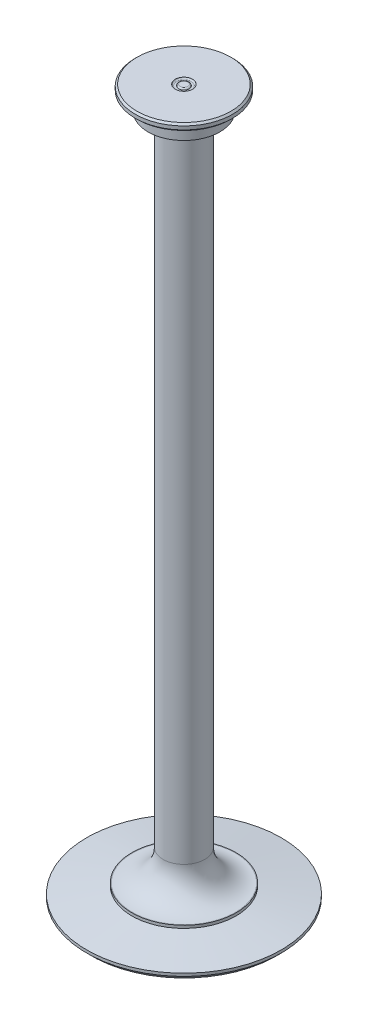
ISO-10303-21;
HEADER;
FILE_DESCRIPTION(('STEP AP214'),'2;1');
FILE_NAME('part.step','',(''),(''),'','','');
FILE_SCHEMA(('AUTOMOTIVE_DESIGN { 1 0 10303 214 1 1 1 1 }'));
ENDSEC;
DATA;
#1=APPLICATION_CONTEXT('core data for automotive mechanical design processes');
#2=APPLICATION_PROTOCOL_DEFINITION('international standard','automotive_design',2000,#1);
#3=PRODUCT_CONTEXT('',#1,'mechanical');
#4=PRODUCT('Part','Part','',(#3));
#5=PRODUCT_RELATED_PRODUCT_CATEGORY('part','',(#4));
#6=PRODUCT_DEFINITION_FORMATION('','',#4);
#7=PRODUCT_DEFINITION_CONTEXT('part definition',#1,'design');
#8=PRODUCT_DEFINITION('design','',#6,#7);
#9=PRODUCT_DEFINITION_SHAPE('','',#8);
#10=(LENGTH_UNIT() NAMED_UNIT(*) SI_UNIT(.MILLI.,.METRE.));
#11=(NAMED_UNIT(*) PLANE_ANGLE_UNIT() SI_UNIT($,.RADIAN.));
#12=(NAMED_UNIT(*) SI_UNIT($,.STERADIAN.) SOLID_ANGLE_UNIT());
#13=UNCERTAINTY_MEASURE_WITH_UNIT(LENGTH_MEASURE(1.E-05),#10,'distance_accuracy_value','');
#14=(GEOMETRIC_REPRESENTATION_CONTEXT(3) GLOBAL_UNCERTAINTY_ASSIGNED_CONTEXT((#13)) GLOBAL_UNIT_ASSIGNED_CONTEXT((#10,
#11,#12)) REPRESENTATION_CONTEXT('',''));
#15=CARTESIAN_POINT('',(0.,0.,0.));
#16=DIRECTION('',(0.,0.,1.));
#17=DIRECTION('',(1.,0.,0.));
#18=AXIS2_PLACEMENT_3D('',#15,#16,#17);
#19=CARTESIAN_POINT('',(0.,99.5012679214001,0.));
#20=DIRECTION('',(0.,1.,0.));
#21=DIRECTION('',(0.,0.,1.));
#22=AXIS2_PLACEMENT_3D('',#19,#20,#21);
#23=PLANE('',#22);
#24=CARTESIAN_POINT('',(0.,99.5012679214001,0.));
#25=DIRECTION('',(0.,1.,0.));
#26=DIRECTION('',(0.,0.,1.));
#27=AXIS2_PLACEMENT_3D('',#24,#25,#26);
#28=CIRCLE('',#27,6.74999999999995);
#29=CARTESIAN_POINT('',(0.,99.5012679214001,6.74999999999995));
#30=VERTEX_POINT('',#29);
#31=EDGE_CURVE('E70',#30,#30,#28,.F.);
#32=ORIENTED_EDGE('',*,*,#31,.T.);
#33=EDGE_LOOP('',(#32));
#34=FACE_BOUND('',#33,.T.);
#35=CARTESIAN_POINT('',(0.,99.5012679214001,0.));
#36=DIRECTION('',(0.,1.,0.));
#37=DIRECTION('',(0.,0.,1.));
#38=AXIS2_PLACEMENT_3D('',#35,#36,#37);
#39=CIRCLE('',#38,5.175);
#40=CARTESIAN_POINT('',(0.,99.5012679214001,5.175));
#41=VERTEX_POINT('',#40);
#42=EDGE_CURVE('E10',#41,#41,#39,.F.);
#43=ORIENTED_EDGE('',*,*,#42,.F.);
#44=EDGE_LOOP('',(#43));
#45=FACE_BOUND('',#44,.T.);
#46=ADVANCED_FACE('F38',(#34,#45),#23,.F.);
#47=CARTESIAN_POINT('',(0.,120.300257794623,0.));
#48=DIRECTION('',(0.,-1.,0.));
#49=DIRECTION('',(0.,0.,-1.));
#50=AXIS2_PLACEMENT_3D('',#47,#48,#49);
#51=CYLINDRICAL_SURFACE('',#50,7.);
#52=CARTESIAN_POINT('',(0.,99.7512679214001,0.));
#53=DIRECTION('',(0.,1.,0.));
#54=DIRECTION('',(0.,0.,1.));
#55=AXIS2_PLACEMENT_3D('',#52,#53,#54);
#56=CIRCLE('',#55,7.);
#57=CARTESIAN_POINT('',(0.,99.7512679214001,-7.));
#58=VERTEX_POINT('',#57);
#59=EDGE_CURVE('E73',#58,#58,#56,.T.);
#60=CARTESIAN_POINT('',(0.,100.2512679214,0.));
#61=DIRECTION('',(0.,1.,0.));
#62=DIRECTION('',(0.,0.,1.));
#63=AXIS2_PLACEMENT_3D('',#60,#61,#62);
#64=CIRCLE('',#63,7.);
#65=CARTESIAN_POINT('',(0.,100.2512679214,-7.));
#66=VERTEX_POINT('',#65);
#67=EDGE_CURVE('E76',#66,#66,#64,.F.);
#68=CARTESIAN_POINT('',(0.,99.7512679214001,-7.));
#69=CARTESIAN_POINT('',(0.,99.7564762547334,-7.));
#70=CARTESIAN_POINT('',(0.,99.7616845880668,-7.));
#71=CARTESIAN_POINT('',(0.,99.7721012547334,-7.));
#72=CARTESIAN_POINT('',(0.,99.7773095880668,-7.));
#73=CARTESIAN_POINT('',(0.,99.7877262547334,-7.));
#74=CARTESIAN_POINT('',(0.,99.7929345880667,-7.));
#75=CARTESIAN_POINT('',(0.,99.8033512547334,-7.));
#76=CARTESIAN_POINT('',(0.,99.8085595880668,-7.));
#77=CARTESIAN_POINT('',(0.,99.8189762547334,-7.));
#78=CARTESIAN_POINT('',(0.,99.8241845880668,-7.));
#79=CARTESIAN_POINT('',(0.,99.8346012547334,-7.));
#80=CARTESIAN_POINT('',(0.,99.8398095880667,-7.));
#81=CARTESIAN_POINT('',(0.,99.8502262547334,-7.));
#82=CARTESIAN_POINT('',(0.,99.8554345880668,-7.));
#83=CARTESIAN_POINT('',(0.,99.8658512547334,-7.));
#84=CARTESIAN_POINT('',(0.,99.8710595880668,-7.));
#85=CARTESIAN_POINT('',(0.,99.8814762547334,-7.));
#86=CARTESIAN_POINT('',(0.,99.8866845880668,-7.));
#87=CARTESIAN_POINT('',(0.,99.8971012547334,-7.));
#88=CARTESIAN_POINT('',(0.,99.9023095880668,-7.));
#89=CARTESIAN_POINT('',(0.,99.9127262547334,-7.));
#90=CARTESIAN_POINT('',(0.,99.9179345880668,-7.));
#91=CARTESIAN_POINT('',(0.,99.9283512547334,-7.));
#92=CARTESIAN_POINT('',(0.,99.9335595880668,-7.));
#93=CARTESIAN_POINT('',(0.,99.9439762547334,-7.));
#94=CARTESIAN_POINT('',(0.,99.9491845880668,-7.));
#95=CARTESIAN_POINT('',(0.,99.9596012547334,-7.));
#96=CARTESIAN_POINT('',(0.,99.9648095880668,-7.));
#97=CARTESIAN_POINT('',(0.,99.9752262547334,-7.));
#98=CARTESIAN_POINT('',(0.,99.9804345880668,-7.));
#99=CARTESIAN_POINT('',(0.,99.9908512547334,-7.));
#100=CARTESIAN_POINT('',(0.,99.9960595880668,-7.));
#101=CARTESIAN_POINT('',(0.,100.006476254733,-7.));
#102=CARTESIAN_POINT('',(0.,100.011684588067,-7.));
#103=CARTESIAN_POINT('',(0.,100.022101254733,-7.));
#104=CARTESIAN_POINT('',(0.,100.027309588067,-7.));
#105=CARTESIAN_POINT('',(0.,100.037726254733,-7.));
#106=CARTESIAN_POINT('',(0.,100.042934588067,-7.));
#107=CARTESIAN_POINT('',(0.,100.053351254733,-7.));
#108=CARTESIAN_POINT('',(0.,100.058559588067,-7.));
#109=CARTESIAN_POINT('',(0.,100.068976254733,-7.));
#110=CARTESIAN_POINT('',(0.,100.074184588067,-7.));
#111=CARTESIAN_POINT('',(0.,100.084601254733,-7.));
#112=CARTESIAN_POINT('',(0.,100.089809588067,-7.));
#113=CARTESIAN_POINT('',(0.,100.100226254733,-7.));
#114=CARTESIAN_POINT('',(0.,100.105434588067,-7.));
#115=CARTESIAN_POINT('',(0.,100.115851254733,-7.));
#116=CARTESIAN_POINT('',(0.,100.121059588067,-7.));
#117=CARTESIAN_POINT('',(0.,100.131476254733,-7.));
#118=CARTESIAN_POINT('',(0.,100.136684588067,-7.));
#119=CARTESIAN_POINT('',(0.,100.147101254733,-7.));
#120=CARTESIAN_POINT('',(0.,100.152309588067,-7.));
#121=CARTESIAN_POINT('',(0.,100.162726254733,-7.));
#122=CARTESIAN_POINT('',(0.,100.167934588067,-7.));
#123=CARTESIAN_POINT('',(0.,100.178351254733,-7.));
#124=CARTESIAN_POINT('',(0.,100.183559588067,-7.));
#125=CARTESIAN_POINT('',(0.,100.193976254733,-7.));
#126=CARTESIAN_POINT('',(0.,100.199184588067,-7.));
#127=CARTESIAN_POINT('',(0.,100.209601254733,-7.));
#128=CARTESIAN_POINT('',(0.,100.214809588067,-7.));
#129=CARTESIAN_POINT('',(0.,100.225226254733,-7.));
#130=CARTESIAN_POINT('',(0.,100.230434588067,-7.));
#131=CARTESIAN_POINT('',(0.,100.240851254733,-7.));
#132=CARTESIAN_POINT('',(0.,100.246059588067,-7.));
#133=CARTESIAN_POINT('',(0.,100.2512679214,-7.));
#134=B_SPLINE_CURVE_WITH_KNOTS('',3,(#68,#69,#70,#71,#72,#73,#74,#75,#76,#77,#78,#79,#80,#81,
#82,#83,#84,#85,#86,#87,#88,#89,#90,#91,#92,#93,#94,#95,#96,#97,#98,#99,#100,#101,#102,#103,
#104,#105,#106,#107,#108,#109,#110,#111,#112,#113,#114,#115,#116,#117,#118,#119,#120,#121,#122,
#123,#124,#125,#126,#127,#128,#129,#130,#131,#132,#133),.UNSPECIFIED.,.F.,.F.,(4,2,2,2,2,2,2,2,
2,2,2,2,2,2,2,2,2,2,2,2,2,2,2,2,2,2,2,2,2,2,2,2,4),(0.,0.0156250000000052,0.0312499999999966,
0.0468750000000018,0.062500000000007,0.0781249999999983,0.0937500000000036,0.109375000000009,
0.125000000000014,0.140625000000005,0.156250000000011,0.171875000000016,0.187500000000007,
0.203125000000012,0.218750000000018,0.234375000000009,0.250000000000014,0.265625000000019,
0.281250000000011,0.296875000000016,0.312500000000021,0.328125000000012,0.343750000000018,
0.359375000000023,0.375000000000014,0.390625000000019,0.406250000000025,0.42187500000003,
0.437500000000021,0.453125000000026,0.468750000000032,0.484375000000023,0.500000000000028),.UNSPECIFIED.);
#135=EDGE_CURVE('BSEAM119',#58,#66,#134,.T.);
#136=ORIENTED_EDGE('',*,*,#59,.T.);
#137=ORIENTED_EDGE('',*,*,#67,.T.);
#138=ORIENTED_EDGE('',*,*,#135,.T.);
#139=ORIENTED_EDGE('',*,*,#135,.F.);
#140=EDGE_LOOP('',(#136,#138,#137,#139));
#141=FACE_BOUND('',#140,.T.);
#142=ADVANCED_FACE('F119',(#141),#51,.T.);
#143=CARTESIAN_POINT('',(0.,100.5012679214,0.));
#144=DIRECTION('',(0.,1.,0.));
#145=DIRECTION('',(0.,0.,1.));
#146=AXIS2_PLACEMENT_3D('',#143,#144,#145);
#147=PLANE('',#146);
#148=CARTESIAN_POINT('',(0.,100.5012679214,0.));
#149=DIRECTION('',(0.,1.,0.));
#150=DIRECTION('',(0.,0.,1.));
#151=AXIS2_PLACEMENT_3D('',#148,#149,#150);
#152=CIRCLE('',#151,1.25);
#153=CARTESIAN_POINT('',(0.,100.5012679214,1.25));
#154=VERTEX_POINT('',#153);
#155=EDGE_CURVE('E88',#154,#154,#152,.T.);
#156=ORIENTED_EDGE('',*,*,#155,.F.);
#157=EDGE_LOOP('',(#156));
#158=FACE_BOUND('',#157,.T.);
#159=CARTESIAN_POINT('',(0.,100.5012679214,0.));
#160=DIRECTION('',(0.,1.,0.));
#161=DIRECTION('',(0.,0.,1.));
#162=AXIS2_PLACEMENT_3D('',#159,#160,#161);
#163=CIRCLE('',#162,6.75000000000006);
#164=CARTESIAN_POINT('',(0.,100.5012679214,6.75000000000006));
#165=VERTEX_POINT('',#164);
#166=EDGE_CURVE('E67',#165,#165,#163,.T.);
#167=ORIENTED_EDGE('',*,*,#166,.T.);
#168=EDGE_LOOP('',(#167));
#169=FACE_BOUND('',#168,.T.);
#170=ADVANCED_FACE('F125',(#158,#169),#147,.T.);
#171=CARTESIAN_POINT('',(0.,99.7512679214001,0.));
#172=DIRECTION('',(0.,1.,0.));
#173=DIRECTION('',(0.,0.,1.));
#174=AXIS2_PLACEMENT_3D('',#171,#172,#173);
#175=CONICAL_SURFACE('',#174,7.,0.785398163397467);
#176=ORIENTED_EDGE('',*,*,#31,.F.);
#177=EDGE_LOOP('',(#176));
#178=FACE_BOUND('',#177,.T.);
#179=ORIENTED_EDGE('',*,*,#59,.F.);
#180=EDGE_LOOP('',(#179));
#181=FACE_BOUND('',#180,.T.);
#182=ADVANCED_FACE('F135',(#178,#181),#175,.T.);
#183=CARTESIAN_POINT('',(0.,100.5012679214,0.));
#184=DIRECTION('',(0.,-1.,0.));
#185=DIRECTION('',(0.,0.,-1.));
#186=AXIS2_PLACEMENT_3D('',#183,#184,#185);
#187=CONICAL_SURFACE('',#186,6.75000000000006,0.78539816339744);
#188=ORIENTED_EDGE('',*,*,#67,.F.);
#189=EDGE_LOOP('',(#188));
#190=FACE_BOUND('',#189,.T.);
#191=ORIENTED_EDGE('',*,*,#166,.F.);
#192=EDGE_LOOP('',(#191));
#193=FACE_BOUND('',#192,.T.);
#194=ADVANCED_FACE('F148',(#190,#193),#187,.T.);
#195=CARTESIAN_POINT('',(0.,100.3012679214,0.));
#196=DIRECTION('',(0.,1.,0.));
#197=DIRECTION('',(0.,0.,1.));
#198=AXIS2_PLACEMENT_3D('',#195,#196,#197);
#199=PLANE('',#198);
#200=CARTESIAN_POINT('',(0.,100.3012679214,0.));
#201=DIRECTION('',(0.,1.,0.));
#202=DIRECTION('',(0.,0.,1.));
#203=AXIS2_PLACEMENT_3D('',#200,#201,#202);
#204=CIRCLE('',#203,1.05);
#205=CARTESIAN_POINT('',(0.,100.3012679214,1.05));
#206=VERTEX_POINT('',#205);
#207=EDGE_CURVE('E49',#206,#206,#204,.T.);
#208=ORIENTED_EDGE('',*,*,#207,.T.);
#209=EDGE_LOOP('',(#208));
#210=FACE_BOUND('',#209,.T.);
#211=CARTESIAN_POINT('',(0.,100.3012679214,0.));
#212=DIRECTION('',(0.,1.,0.));
#213=DIRECTION('',(0.,0.,1.));
#214=AXIS2_PLACEMENT_3D('',#211,#212,#213);
#215=CIRCLE('',#214,0.75);
#216=CARTESIAN_POINT('',(0.,100.3012679214,0.75));
#217=VERTEX_POINT('',#216);
#218=EDGE_CURVE('E91',#217,#217,#215,.T.);
#219=ORIENTED_EDGE('',*,*,#218,.F.);
#220=EDGE_LOOP('',(#219));
#221=FACE_BOUND('',#220,.T.);
#222=ADVANCED_FACE('F152',(#210,#221),#199,.T.);
#223=CARTESIAN_POINT('',(0.,100.5012679214,0.));
#224=DIRECTION('',(0.,1.,0.));
#225=DIRECTION('',(0.,0.,1.));
#226=AXIS2_PLACEMENT_3D('',#223,#224,#225);
#227=CIRCLE('',#226,0.55);
#228=CARTESIAN_POINT('',(0.,100.5012679214,0.55));
#229=VERTEX_POINT('',#228);
#230=EDGE_CURVE('E45',#229,#229,#227,.T.);
#231=ORIENTED_EDGE('',*,*,#230,.T.);
#232=EDGE_LOOP('',(#231));
#233=FACE_BOUND('',#232,.T.);
#234=ADVANCED_FACE('F137',(#233),#147,.T.);
#235=CARTESIAN_POINT('',(0.,100.5012679214,0.));
#236=DIRECTION('',(0.,1.,0.));
#237=DIRECTION('',(0.,0.,1.));
#238=AXIS2_PLACEMENT_3D('',#235,#236,#237);
#239=TOROIDAL_SURFACE('',#238,1.05,0.2);
#240=ORIENTED_EDGE('',*,*,#155,.T.);
#241=EDGE_LOOP('',(#240));
#242=FACE_BOUND('',#241,.T.);
#243=ORIENTED_EDGE('',*,*,#207,.F.);
#244=EDGE_LOOP('',(#243));
#245=FACE_BOUND('',#244,.T.);
#246=ADVANCED_FACE('F116',(#242,#245),#239,.F.);
#247=CARTESIAN_POINT('',(0.,100.3012679214,0.));
#248=DIRECTION('',(0.,1.,0.));
#249=DIRECTION('',(0.,0.,1.));
#250=AXIS2_PLACEMENT_3D('',#247,#248,#249);
#251=TOROIDAL_SURFACE('',#250,0.55,0.2);
#252=ORIENTED_EDGE('',*,*,#218,.T.);
#253=EDGE_LOOP('',(#252));
#254=FACE_BOUND('',#253,.T.);
#255=ORIENTED_EDGE('',*,*,#230,.F.);
#256=EDGE_LOOP('',(#255));
#257=FACE_BOUND('',#256,.T.);
#258=ADVANCED_FACE('F40',(#254,#257),#251,.T.);
#259=CARTESIAN_POINT('',(0.,97.1412679214001,0.));
#260=DIRECTION('',(0.,-1.,0.));
#261=DIRECTION('',(0.,0.,-1.));
#262=AXIS2_PLACEMENT_3D('',#259,#260,#261);
#263=PLANE('',#262);
#264=CARTESIAN_POINT('',(0.,97.1412679214001,0.));
#265=DIRECTION('',(0.,-1.,0.));
#266=DIRECTION('',(0.,0.,-1.));
#267=AXIS2_PLACEMENT_3D('',#264,#265,#266);
#268=CIRCLE('',#267,5.175);
#269=CARTESIAN_POINT('',(0.,97.1412679214001,-5.175));
#270=VERTEX_POINT('',#269);
#271=EDGE_CURVE('E94',#270,#270,#268,.T.);
#272=ORIENTED_EDGE('',*,*,#271,.T.);
#273=EDGE_LOOP('',(#272));
#274=FACE_BOUND('',#273,.T.);
#275=CARTESIAN_POINT('',(0.,97.1412679214001,0.));
#276=DIRECTION('',(0.,-1.,0.));
#277=DIRECTION('',(0.,0.,-1.));
#278=AXIS2_PLACEMENT_3D('',#275,#276,#277);
#279=CIRCLE('',#278,2.99999999999999);
#280=CARTESIAN_POINT('',(0.,97.1412679214001,-2.99999999999999));
#281=VERTEX_POINT('',#280);
#282=EDGE_CURVE('E97',#281,#281,#279,.T.);
#283=ORIENTED_EDGE('',*,*,#282,.F.);
#284=EDGE_LOOP('',(#283));
#285=FACE_BOUND('',#284,.T.);
#286=ADVANCED_FACE('F104',(#274,#285),#263,.T.);
#287=CARTESIAN_POINT('',(0.,97.1412679214001,0.));
#288=DIRECTION('',(0.,1.,0.));
#289=DIRECTION('',(0.,0.,1.));
#290=AXIS2_PLACEMENT_3D('',#287,#288,#289);
#291=CYLINDRICAL_SURFACE('',#290,5.175);
#292=ORIENTED_EDGE('',*,*,#271,.F.);
#293=EDGE_LOOP('',(#292));
#294=FACE_BOUND('',#293,.T.);
#295=ORIENTED_EDGE('',*,*,#42,.T.);
#296=EDGE_LOOP('',(#295));
#297=FACE_BOUND('',#296,.T.);
#298=ADVANCED_FACE('F106',(#294,#297),#291,.T.);
#299=CARTESIAN_POINT('',(0.,-1.5,0.));
#300=DIRECTION('',(0.,-1.,0.));
#301=DIRECTION('',(0.,0.,-1.));
#302=AXIS2_PLACEMENT_3D('',#299,#300,#301);
#303=PLANE('',#302);
#304=CARTESIAN_POINT('',(0.,-1.5,0.));
#305=DIRECTION('',(0.,-1.,0.));
#306=DIRECTION('',(0.,0.,-1.));
#307=AXIS2_PLACEMENT_3D('',#304,#305,#306);
#308=CIRCLE('',#307,13.3);
#309=CARTESIAN_POINT('',(0.,-1.5,-13.3));
#310=VERTEX_POINT('',#309);
#311=EDGE_CURVE('E64',#310,#310,#308,.T.);
#312=ORIENTED_EDGE('',*,*,#311,.T.);
#313=EDGE_LOOP('',(#312));
#314=FACE_BOUND('',#313,.T.);
#315=ADVANCED_FACE('F113',(#314),#303,.T.);
#316=CARTESIAN_POINT('',(0.,-1.5,0.));
#317=DIRECTION('',(0.,1.,0.));
#318=DIRECTION('',(0.,0.,1.));
#319=AXIS2_PLACEMENT_3D('',#316,#317,#318);
#320=CONICAL_SURFACE('',#319,13.3,0.785398163397452);
#321=CARTESIAN_POINT('',(0.,-0.799999999999999,0.));
#322=DIRECTION('',(0.,-1.,0.));
#323=DIRECTION('',(0.,0.,-1.));
#324=AXIS2_PLACEMENT_3D('',#321,#322,#323);
#325=CIRCLE('',#324,14.);
#326=CARTESIAN_POINT('',(0.,-0.799999999999999,-14.));
#327=VERTEX_POINT('',#326);
#328=EDGE_CURVE('E61',#327,#327,#325,.F.);
#329=ORIENTED_EDGE('',*,*,#328,.F.);
#330=EDGE_LOOP('',(#329));
#331=FACE_BOUND('',#330,.T.);
#332=ORIENTED_EDGE('',*,*,#311,.F.);
#333=EDGE_LOOP('',(#332));
#334=FACE_BOUND('',#333,.T.);
#335=ADVANCED_FACE('F154',(#331,#334),#320,.T.);
#336=CARTESIAN_POINT('',(0.,-1.5,0.));
#337=DIRECTION('',(0.,1.,0.));
#338=DIRECTION('',(0.,0.,1.));
#339=AXIS2_PLACEMENT_3D('',#336,#337,#338);
#340=CYLINDRICAL_SURFACE('',#339,14.);
#341=ORIENTED_EDGE('',*,*,#328,.T.);
#342=EDGE_LOOP('',(#341));
#343=FACE_BOUND('',#342,.T.);
#344=CARTESIAN_POINT('',(0.,-0.399999999999999,0.));
#345=DIRECTION('',(0.,-1.,0.));
#346=DIRECTION('',(0.,0.,-1.));
#347=AXIS2_PLACEMENT_3D('',#344,#345,#346);
#348=CIRCLE('',#347,14.);
#349=CARTESIAN_POINT('',(0.,-0.399999999999999,-14.));
#350=VERTEX_POINT('',#349);
#351=EDGE_CURVE('E82',#350,#350,#348,.T.);
#352=ORIENTED_EDGE('',*,*,#351,.T.);
#353=EDGE_LOOP('',(#352));
#354=FACE_BOUND('',#353,.T.);
#355=ADVANCED_FACE('F130',(#343,#354),#340,.T.);
#356=CARTESIAN_POINT('',(0.,-0.399999999999999,0.));
#357=DIRECTION('',(0.,-1.,0.));
#358=DIRECTION('',(0.,0.,-1.));
#359=AXIS2_PLACEMENT_3D('',#356,#357,#358);
#360=CONICAL_SURFACE('',#359,14.,1.42075684237617);
#361=CARTESIAN_POINT('',(0.,0.58264143,0.));
#362=DIRECTION('',(0.,-1.,0.));
#363=DIRECTION('',(0.,0.,-1.));
#364=AXIS2_PLACEMENT_3D('',#361,#362,#363);
#365=CIRCLE('',#364,7.5);
#366=CARTESIAN_POINT('',(0.,0.58264143,-7.5));
#367=VERTEX_POINT('',#366);
#368=EDGE_CURVE('E79',#367,#367,#365,.T.);
#369=ORIENTED_EDGE('',*,*,#368,.T.);
#370=EDGE_LOOP('',(#369));
#371=FACE_BOUND('',#370,.T.);
#372=ORIENTED_EDGE('',*,*,#351,.F.);
#373=EDGE_LOOP('',(#372));
#374=FACE_BOUND('',#373,.T.);
#375=ADVANCED_FACE('F177',(#371,#374),#360,.T.);
#376=CARTESIAN_POINT('',(0.,0.,0.));
#377=DIRECTION('',(0.,-1.,0.));
#378=DIRECTION('',(0.,0.,-1.));
#379=AXIS2_PLACEMENT_3D('',#376,#377,#378);
#380=CYLINDRICAL_SURFACE('',#379,7.5);
#381=CARTESIAN_POINT('',(0.,0.98,0.));
#382=DIRECTION('',(0.,-1.,0.));
#383=DIRECTION('',(0.,0.,-1.));
#384=AXIS2_PLACEMENT_3D('',#381,#382,#383);
#385=CIRCLE('',#384,7.5);
#386=CARTESIAN_POINT('',(0.,0.98,-7.5));
#387=VERTEX_POINT('',#386);
#388=EDGE_CURVE('E85',#387,#387,#385,.T.);
#389=ORIENTED_EDGE('',*,*,#388,.T.);
#390=EDGE_LOOP('',(#389));
#391=FACE_BOUND('',#390,.T.);
#392=ORIENTED_EDGE('',*,*,#368,.F.);
#393=EDGE_LOOP('',(#392));
#394=FACE_BOUND('',#393,.T.);
#395=ADVANCED_FACE('F142',(#391,#394),#380,.T.);
#396=CARTESIAN_POINT('',(-2.99999999999999,0.98,0.));
#397=DIRECTION('',(0.,-1.,0.));
#398=DIRECTION('',(0.,0.,-1.));
#399=AXIS2_PLACEMENT_3D('',#396,#397,#398);
#400=PLANE('',#399);
#401=CARTESIAN_POINT('',(0.,0.98,0.));
#402=DIRECTION('',(0.,-1.,0.));
#403=DIRECTION('',(0.,0.,-1.));
#404=AXIS2_PLACEMENT_3D('',#401,#402,#403);
#405=CIRCLE('',#404,7.4);
#406=CARTESIAN_POINT('',(0.,0.98,-7.4));
#407=VERTEX_POINT('',#406);
#408=EDGE_CURVE('E58',#407,#407,#405,.T.);
#409=ORIENTED_EDGE('',*,*,#408,.T.);
#410=EDGE_LOOP('',(#409));
#411=FACE_BOUND('',#410,.T.);
#412=ORIENTED_EDGE('',*,*,#388,.F.);
#413=EDGE_LOOP('',(#412));
#414=FACE_BOUND('',#413,.T.);
#415=ADVANCED_FACE('F138',(#411,#414),#400,.F.);
#416=CARTESIAN_POINT('',(0.,5.38,0.));
#417=DIRECTION('',(0.,-1.,0.));
#418=DIRECTION('',(0.,0.,-1.));
#419=AXIS2_PLACEMENT_3D('',#416,#417,#418);
#420=TOROIDAL_SURFACE('',#419,7.4,4.4);
#421=CARTESIAN_POINT('',(0.,5.38,0.));
#422=DIRECTION('',(0.,-1.,0.));
#423=DIRECTION('',(0.,0.,-1.));
#424=AXIS2_PLACEMENT_3D('',#421,#422,#423);
#425=CIRCLE('',#424,2.99999999999999);
#426=CARTESIAN_POINT('',(0.,5.38,-2.99999999999999));
#427=VERTEX_POINT('',#426);
#428=EDGE_CURVE('E53',#427,#427,#425,.F.);
#429=ORIENTED_EDGE('',*,*,#428,.F.);
#430=EDGE_LOOP('',(#429));
#431=FACE_BOUND('',#430,.T.);
#432=ORIENTED_EDGE('',*,*,#408,.F.);
#433=EDGE_LOOP('',(#432));
#434=FACE_BOUND('',#433,.T.);
#435=ADVANCED_FACE('F141',(#431,#434),#420,.F.);
#436=CARTESIAN_POINT('',(0.,0.,0.));
#437=DIRECTION('',(0.,-1.,0.));
#438=DIRECTION('',(0.,0.,-1.));
#439=AXIS2_PLACEMENT_3D('',#436,#437,#438);
#440=CYLINDRICAL_SURFACE('',#439,2.99999999999999);
#441=ORIENTED_EDGE('',*,*,#282,.T.);
#442=EDGE_LOOP('',(#441));
#443=FACE_BOUND('',#442,.T.);
#444=ORIENTED_EDGE('',*,*,#428,.T.);
#445=EDGE_LOOP('',(#444));
#446=FACE_BOUND('',#445,.T.);
#447=ADVANCED_FACE('F101',(#443,#446),#440,.T.);
#448=CLOSED_SHELL('',(#46,#142,#170,#182,#194,#222,#234,#246,#258,#286,#298,#315,#335,#355,#375,
#395,#415,#435,#447));
#449=MANIFOLD_SOLID_BREP('B2',#448);
#450=ADVANCED_BREP_SHAPE_REPRESENTATION('',(#18,#449),#14);
#451=SHAPE_DEFINITION_REPRESENTATION(#9,#450);
ENDSEC;
END-ISO-10303-21;
